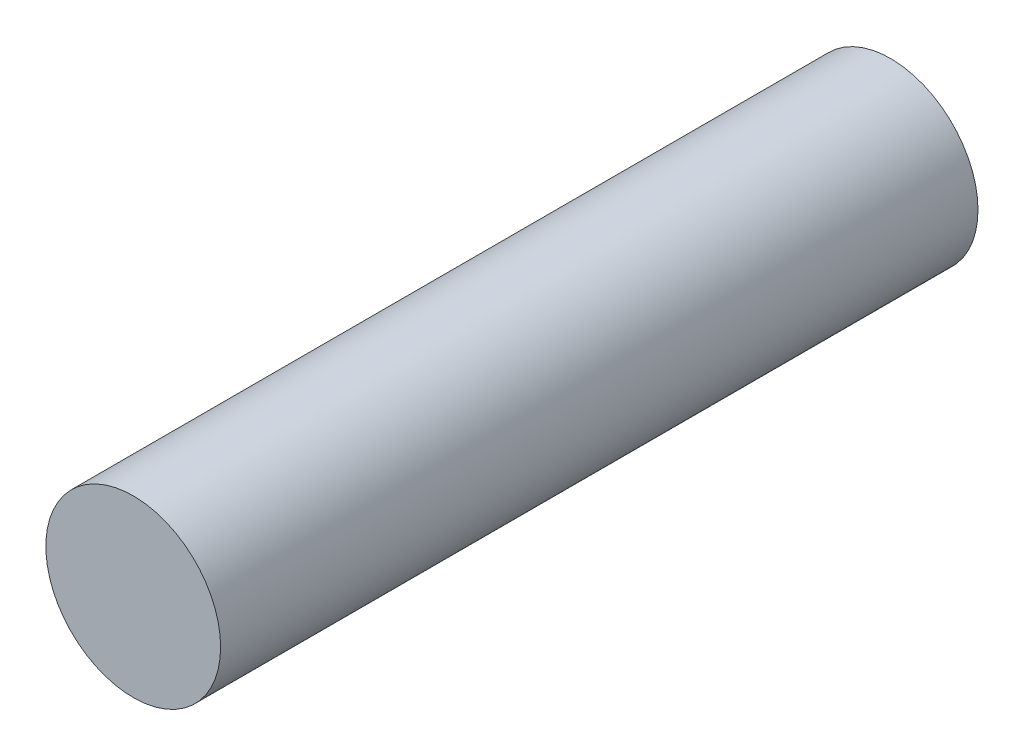
ISO-10303-21;
HEADER;
FILE_DESCRIPTION(('STEP AP214'),'2;1');
FILE_NAME('part.step','',(''),(''),'','','');
FILE_SCHEMA(('AUTOMOTIVE_DESIGN { 1 0 10303 214 1 1 1 1 }'));
ENDSEC;
DATA;
#1=APPLICATION_CONTEXT('core data for automotive mechanical design processes');
#2=APPLICATION_PROTOCOL_DEFINITION('international standard','automotive_design',2000,#1);
#3=PRODUCT_CONTEXT('',#1,'mechanical');
#4=PRODUCT('Part','Part','',(#3));
#5=PRODUCT_RELATED_PRODUCT_CATEGORY('part','',(#4));
#6=PRODUCT_DEFINITION_FORMATION('','',#4);
#7=PRODUCT_DEFINITION_CONTEXT('part definition',#1,'design');
#8=PRODUCT_DEFINITION('design','',#6,#7);
#9=PRODUCT_DEFINITION_SHAPE('','',#8);
#10=(LENGTH_UNIT() NAMED_UNIT(*) SI_UNIT(.MILLI.,.METRE.));
#11=(NAMED_UNIT(*) PLANE_ANGLE_UNIT() SI_UNIT($,.RADIAN.));
#12=(NAMED_UNIT(*) SI_UNIT($,.STERADIAN.) SOLID_ANGLE_UNIT());
#13=UNCERTAINTY_MEASURE_WITH_UNIT(LENGTH_MEASURE(1.E-05),#10,'distance_accuracy_value','');
#14=(GEOMETRIC_REPRESENTATION_CONTEXT(3) GLOBAL_UNCERTAINTY_ASSIGNED_CONTEXT((#13)) GLOBAL_UNIT_ASSIGNED_CONTEXT((#10,
#11,#12)) REPRESENTATION_CONTEXT('',''));
#15=CARTESIAN_POINT('',(0.,0.,0.));
#16=DIRECTION('',(0.,0.,1.));
#17=DIRECTION('',(1.,0.,0.));
#18=AXIS2_PLACEMENT_3D('',#15,#16,#17);
#19=CARTESIAN_POINT('',(0.,0.,65.));
#20=DIRECTION('',(0.,0.,-1.));
#21=DIRECTION('',(-1.,0.,0.));
#22=AXIS2_PLACEMENT_3D('',#19,#20,#21);
#23=CYLINDRICAL_SURFACE('',#22,7.5);
#24=CARTESIAN_POINT('',(0.,0.,65.));
#25=DIRECTION('',(0.,0.,1.));
#26=DIRECTION('',(1.,0.,0.));
#27=AXIS2_PLACEMENT_3D('',#24,#25,#26);
#28=CIRCLE('',#27,7.5);
#29=CARTESIAN_POINT('',(7.5,0.,65.));
#30=VERTEX_POINT('',#29);
#31=EDGE_CURVE('E10',#30,#30,#28,.T.);
#32=ORIENTED_EDGE('',*,*,#31,.F.);
#33=EDGE_LOOP('',(#32));
#34=FACE_BOUND('',#33,.T.);
#35=CARTESIAN_POINT('',(0.,0.,0.));
#36=DIRECTION('',(0.,0.,1.));
#37=DIRECTION('',(1.,0.,0.));
#38=AXIS2_PLACEMENT_3D('',#35,#36,#37);
#39=CIRCLE('',#38,7.5);
#40=CARTESIAN_POINT('',(7.5,0.,0.));
#41=VERTEX_POINT('',#40);
#42=EDGE_CURVE('E40',#41,#41,#39,.T.);
#43=ORIENTED_EDGE('',*,*,#42,.T.);
#44=EDGE_LOOP('',(#43));
#45=FACE_BOUND('',#44,.T.);
#46=ADVANCED_FACE('F37',(#34,#45),#23,.T.);
#47=CARTESIAN_POINT('',(0.,0.,65.));
#48=DIRECTION('',(0.,0.,1.));
#49=DIRECTION('',(1.,0.,0.));
#50=AXIS2_PLACEMENT_3D('',#47,#48,#49);
#51=PLANE('',#50);
#52=ORIENTED_EDGE('',*,*,#31,.T.);
#53=EDGE_LOOP('',(#52));
#54=FACE_BOUND('',#53,.T.);
#55=ADVANCED_FACE('F52',(#54),#51,.T.);
#56=CARTESIAN_POINT('',(0.,0.,0.));
#57=DIRECTION('',(0.,0.,1.));
#58=DIRECTION('',(1.,0.,0.));
#59=AXIS2_PLACEMENT_3D('',#56,#57,#58);
#60=PLANE('',#59);
#61=ORIENTED_EDGE('',*,*,#42,.F.);
#62=EDGE_LOOP('',(#61));
#63=FACE_BOUND('',#62,.T.);
#64=ADVANCED_FACE('F50',(#63),#60,.F.);
#65=CLOSED_SHELL('',(#46,#55,#64));
#66=MANIFOLD_SOLID_BREP('B2',#65);
#67=ADVANCED_BREP_SHAPE_REPRESENTATION('',(#18,#66),#14);
#68=SHAPE_DEFINITION_REPRESENTATION(#9,#67);
ENDSEC;
END-ISO-10303-21;
